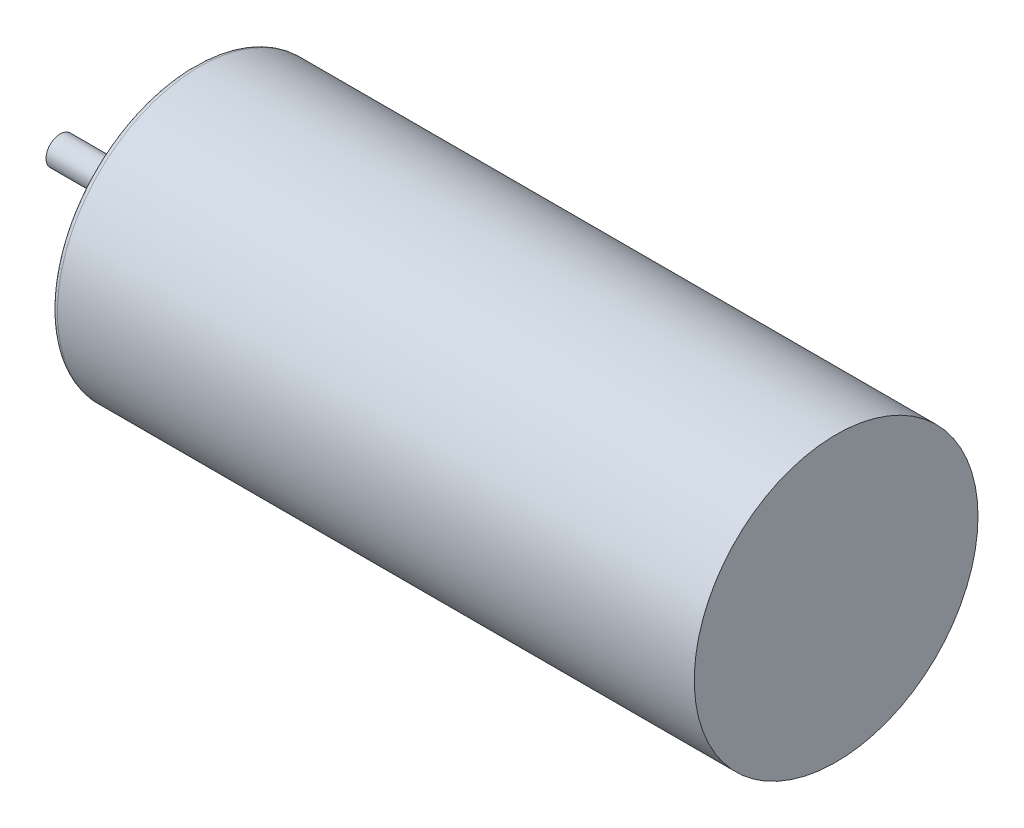
ISO-10303-21;
HEADER;
FILE_DESCRIPTION(('STEP AP214'),'2;1');
FILE_NAME('part.step','',(''),(''),'','','');
FILE_SCHEMA(('AUTOMOTIVE_DESIGN { 1 0 10303 214 1 1 1 1 }'));
ENDSEC;
DATA;
#1=APPLICATION_CONTEXT('core data for automotive mechanical design processes');
#2=APPLICATION_PROTOCOL_DEFINITION('international standard','automotive_design',2000,#1);
#3=PRODUCT_CONTEXT('',#1,'mechanical');
#4=PRODUCT('Part','Part','',(#3));
#5=PRODUCT_RELATED_PRODUCT_CATEGORY('part','',(#4));
#6=PRODUCT_DEFINITION_FORMATION('','',#4);
#7=PRODUCT_DEFINITION_CONTEXT('part definition',#1,'design');
#8=PRODUCT_DEFINITION('design','',#6,#7);
#9=PRODUCT_DEFINITION_SHAPE('','',#8);
#10=(LENGTH_UNIT() NAMED_UNIT(*) SI_UNIT(.MILLI.,.METRE.));
#11=(NAMED_UNIT(*) PLANE_ANGLE_UNIT() SI_UNIT($,.RADIAN.));
#12=(NAMED_UNIT(*) SI_UNIT($,.STERADIAN.) SOLID_ANGLE_UNIT());
#13=UNCERTAINTY_MEASURE_WITH_UNIT(LENGTH_MEASURE(1.E-05),#10,'distance_accuracy_value','');
#14=(GEOMETRIC_REPRESENTATION_CONTEXT(3) GLOBAL_UNCERTAINTY_ASSIGNED_CONTEXT((#13)) GLOBAL_UNIT_ASSIGNED_CONTEXT((#10,
#11,#12)) REPRESENTATION_CONTEXT('',''));
#15=CARTESIAN_POINT('',(0.,0.,0.));
#16=DIRECTION('',(0.,0.,1.));
#17=DIRECTION('',(1.,0.,0.));
#18=AXIS2_PLACEMENT_3D('',#15,#16,#17);
#19=CARTESIAN_POINT('',(-22.65,0.,0.));
#20=DIRECTION('',(1.,0.,0.));
#21=DIRECTION('',(0.,0.,-1.));
#22=AXIS2_PLACEMENT_3D('',#19,#20,#21);
#23=CYLINDRICAL_SURFACE('',#22,5.);
#24=CARTESIAN_POINT('',(-22.45,0.,0.));
#25=DIRECTION('',(1.,0.,0.));
#26=DIRECTION('',(0.,0.,-1.));
#27=AXIS2_PLACEMENT_3D('',#24,#25,#26);
#28=CIRCLE('',#27,5.);
#29=CARTESIAN_POINT('',(-22.45,0.,-5.));
#30=VERTEX_POINT('',#29);
#31=EDGE_CURVE('E44',#30,#30,#28,.T.);
#32=ORIENTED_EDGE('',*,*,#31,.T.);
#33=EDGE_LOOP('',(#32));
#34=FACE_BOUND('',#33,.T.);
#35=CARTESIAN_POINT('',(0.,0.,0.));
#36=DIRECTION('',(1.,0.,0.));
#37=DIRECTION('',(0.,0.,-1.));
#38=AXIS2_PLACEMENT_3D('',#35,#36,#37);
#39=CIRCLE('',#38,5.);
#40=CARTESIAN_POINT('',(0.,0.,-5.));
#41=VERTEX_POINT('',#40);
#42=EDGE_CURVE('E52',#41,#41,#39,.T.);
#43=ORIENTED_EDGE('',*,*,#42,.F.);
#44=EDGE_LOOP('',(#43));
#45=FACE_BOUND('',#44,.T.);
#46=ADVANCED_FACE('F37',(#34,#45),#23,.T.);
#47=CARTESIAN_POINT('',(-22.65,0.,0.));
#48=DIRECTION('',(1.,0.,0.));
#49=DIRECTION('',(0.,0.,-1.));
#50=AXIS2_PLACEMENT_3D('',#47,#48,#49);
#51=PLANE('',#50);
#52=CARTESIAN_POINT('',(-22.65,0.,0.));
#53=DIRECTION('',(1.,0.,0.));
#54=DIRECTION('',(0.,0.,-1.));
#55=AXIS2_PLACEMENT_3D('',#52,#53,#54);
#56=CIRCLE('',#55,4.8);
#57=CARTESIAN_POINT('',(-22.65,0.,-4.8));
#58=VERTEX_POINT('',#57);
#59=EDGE_CURVE('E10',#58,#58,#56,.F.);
#60=ORIENTED_EDGE('',*,*,#59,.T.);
#61=EDGE_LOOP('',(#60));
#62=FACE_BOUND('',#61,.T.);
#63=CARTESIAN_POINT('',(-22.65,0.,0.));
#64=DIRECTION('',(1.,0.,0.));
#65=DIRECTION('',(0.,0.,-1.));
#66=AXIS2_PLACEMENT_3D('',#63,#64,#65);
#67=CIRCLE('',#66,1.);
#68=CARTESIAN_POINT('',(-22.65,0.,-1.));
#69=VERTEX_POINT('',#68);
#70=EDGE_CURVE('E48',#69,#69,#67,.F.);
#71=ORIENTED_EDGE('',*,*,#70,.F.);
#72=EDGE_LOOP('',(#71));
#73=FACE_BOUND('',#72,.T.);
#74=ADVANCED_FACE('F76',(#62,#73),#51,.F.);
#75=CARTESIAN_POINT('',(0.,0.,0.));
#76=DIRECTION('',(1.,0.,0.));
#77=DIRECTION('',(0.,0.,-1.));
#78=AXIS2_PLACEMENT_3D('',#75,#76,#77);
#79=PLANE('',#78);
#80=ORIENTED_EDGE('',*,*,#42,.T.);
#81=EDGE_LOOP('',(#80));
#82=FACE_BOUND('',#81,.T.);
#83=ADVANCED_FACE('F72',(#82),#79,.T.);
#84=CARTESIAN_POINT('',(-23.15,0.,0.));
#85=DIRECTION('',(1.,0.,0.));
#86=DIRECTION('',(0.,0.,-1.));
#87=AXIS2_PLACEMENT_3D('',#84,#85,#86);
#88=CYLINDRICAL_SURFACE('',#87,1.);
#89=CARTESIAN_POINT('',(-23.15,0.,0.));
#90=DIRECTION('',(-1.,0.,0.));
#91=DIRECTION('',(0.,0.,1.));
#92=AXIS2_PLACEMENT_3D('',#89,#90,#91);
#93=CIRCLE('',#92,1.);
#94=CARTESIAN_POINT('',(-23.15,0.,1.));
#95=VERTEX_POINT('',#94);
#96=EDGE_CURVE('E59',#95,#95,#93,.T.);
#97=ORIENTED_EDGE('',*,*,#96,.F.);
#98=EDGE_LOOP('',(#97));
#99=FACE_BOUND('',#98,.T.);
#100=ORIENTED_EDGE('',*,*,#70,.T.);
#101=EDGE_LOOP('',(#100));
#102=FACE_BOUND('',#101,.T.);
#103=ADVANCED_FACE('F69',(#99,#102),#88,.T.);
#104=CARTESIAN_POINT('',(-23.15,0.,0.));
#105=DIRECTION('',(-1.,0.,0.));
#106=DIRECTION('',(0.,0.,1.));
#107=AXIS2_PLACEMENT_3D('',#104,#105,#106);
#108=PLANE('',#107);
#109=CARTESIAN_POINT('',(-23.15,0.,0.));
#110=DIRECTION('',(-1.,0.,0.));
#111=DIRECTION('',(0.,0.,1.));
#112=AXIS2_PLACEMENT_3D('',#109,#110,#111);
#113=CIRCLE('',#112,0.5);
#114=CARTESIAN_POINT('',(-23.15,0.,0.5));
#115=VERTEX_POINT('',#114);
#116=EDGE_CURVE('E55',#115,#115,#113,.T.);
#117=ORIENTED_EDGE('',*,*,#116,.F.);
#118=EDGE_LOOP('',(#117));
#119=FACE_BOUND('',#118,.T.);
#120=ORIENTED_EDGE('',*,*,#96,.T.);
#121=EDGE_LOOP('',(#120));
#122=FACE_BOUND('',#121,.T.);
#123=ADVANCED_FACE('F67',(#119,#122),#108,.T.);
#124=CARTESIAN_POINT('',(-27.35,0.,0.));
#125=DIRECTION('',(-1.,0.,0.));
#126=DIRECTION('',(0.,0.,1.));
#127=AXIS2_PLACEMENT_3D('',#124,#125,#126);
#128=PLANE('',#127);
#129=CARTESIAN_POINT('',(-27.35,0.,0.));
#130=DIRECTION('',(-1.,0.,0.));
#131=DIRECTION('',(0.,0.,1.));
#132=AXIS2_PLACEMENT_3D('',#129,#130,#131);
#133=CIRCLE('',#132,0.5);
#134=CARTESIAN_POINT('',(-27.35,0.,0.5));
#135=VERTEX_POINT('',#134);
#136=EDGE_CURVE('E58',#135,#135,#133,.T.);
#137=ORIENTED_EDGE('',*,*,#136,.T.);
#138=EDGE_LOOP('',(#137));
#139=FACE_BOUND('',#138,.T.);
#140=ADVANCED_FACE('F90',(#139),#128,.T.);
#141=CARTESIAN_POINT('',(-27.35,0.,0.));
#142=DIRECTION('',(1.,0.,0.));
#143=DIRECTION('',(0.,0.,-1.));
#144=AXIS2_PLACEMENT_3D('',#141,#142,#143);
#145=CYLINDRICAL_SURFACE('',#144,0.5);
#146=ORIENTED_EDGE('',*,*,#116,.T.);
#147=EDGE_LOOP('',(#146));
#148=FACE_BOUND('',#147,.T.);
#149=ORIENTED_EDGE('',*,*,#136,.F.);
#150=EDGE_LOOP('',(#149));
#151=FACE_BOUND('',#150,.T.);
#152=ADVANCED_FACE('F87',(#148,#151),#145,.T.);
#153=CARTESIAN_POINT('',(-22.45,0.,0.));
#154=DIRECTION('',(1.,0.,0.));
#155=DIRECTION('',(0.,0.,-1.));
#156=AXIS2_PLACEMENT_3D('',#153,#154,#155);
#157=TOROIDAL_SURFACE('',#156,4.8,0.2);
#158=ORIENTED_EDGE('',*,*,#59,.F.);
#159=EDGE_LOOP('',(#158));
#160=FACE_BOUND('',#159,.T.);
#161=ORIENTED_EDGE('',*,*,#31,.F.);
#162=EDGE_LOOP('',(#161));
#163=FACE_BOUND('',#162,.T.);
#164=ADVANCED_FACE('F39',(#160,#163),#157,.T.);
#165=CLOSED_SHELL('',(#46,#74,#83,#103,#123,#140,#152,#164));
#166=MANIFOLD_SOLID_BREP('B2',#165);
#167=ADVANCED_BREP_SHAPE_REPRESENTATION('',(#18,#166),#14);
#168=SHAPE_DEFINITION_REPRESENTATION(#9,#167);
ENDSEC;
END-ISO-10303-21;
